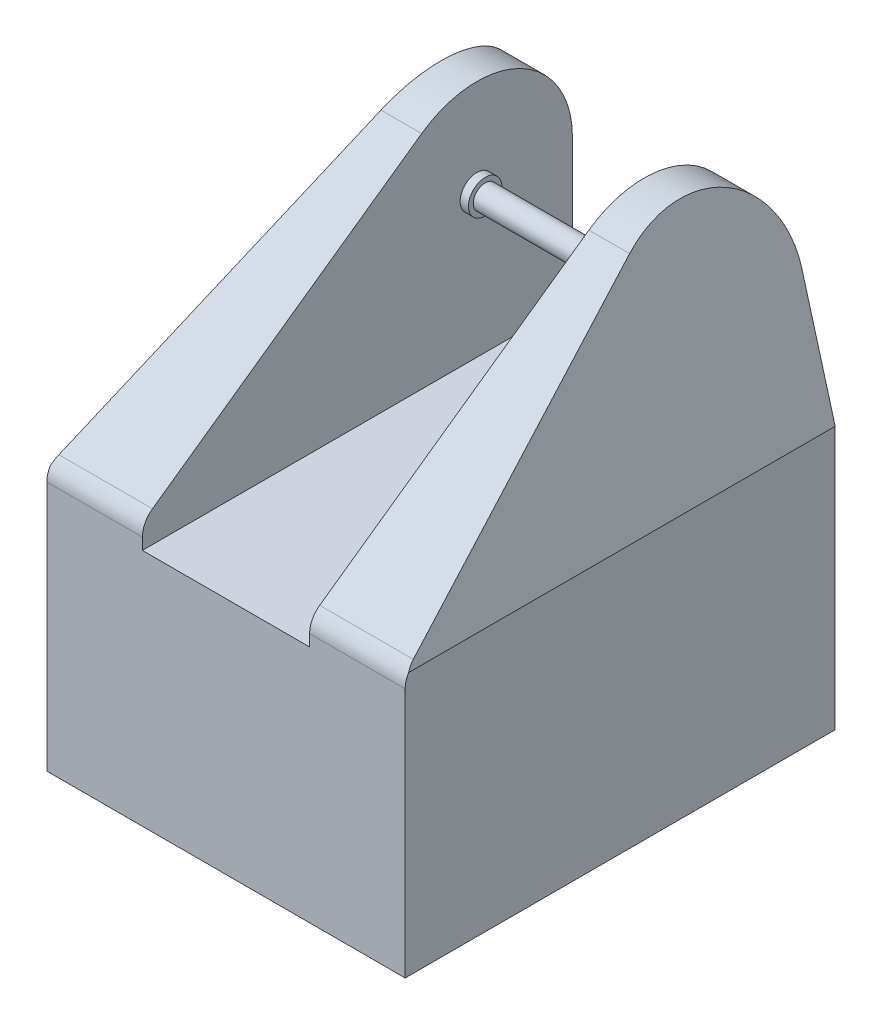
ISO-10303-21;
HEADER;
FILE_DESCRIPTION(('STEP AP214'),'2;1');
FILE_NAME('part.step','',(''),(''),'','','');
FILE_SCHEMA(('AUTOMOTIVE_DESIGN { 1 0 10303 214 1 1 1 1 }'));
ENDSEC;
DATA;
#1=APPLICATION_CONTEXT('core data for automotive mechanical design processes');
#2=APPLICATION_PROTOCOL_DEFINITION('international standard','automotive_design',2000,#1);
#3=PRODUCT_CONTEXT('',#1,'mechanical');
#4=PRODUCT('Part','Part','',(#3));
#5=PRODUCT_RELATED_PRODUCT_CATEGORY('part','',(#4));
#6=PRODUCT_DEFINITION_FORMATION('','',#4);
#7=PRODUCT_DEFINITION_CONTEXT('part definition',#1,'design');
#8=PRODUCT_DEFINITION('design','',#6,#7);
#9=PRODUCT_DEFINITION_SHAPE('','',#8);
#10=(LENGTH_UNIT() NAMED_UNIT(*) SI_UNIT(.MILLI.,.METRE.));
#11=(NAMED_UNIT(*) PLANE_ANGLE_UNIT() SI_UNIT($,.RADIAN.));
#12=(NAMED_UNIT(*) SI_UNIT($,.STERADIAN.) SOLID_ANGLE_UNIT());
#13=UNCERTAINTY_MEASURE_WITH_UNIT(LENGTH_MEASURE(1.E-05),#10,'distance_accuracy_value','');
#14=(GEOMETRIC_REPRESENTATION_CONTEXT(3) GLOBAL_UNCERTAINTY_ASSIGNED_CONTEXT((#13)) GLOBAL_UNIT_ASSIGNED_CONTEXT((#10,
#11,#12)) REPRESENTATION_CONTEXT('',''));
#15=CARTESIAN_POINT('',(0.,0.,0.));
#16=DIRECTION('',(0.,0.,1.));
#17=DIRECTION('',(1.,0.,0.));
#18=AXIS2_PLACEMENT_3D('',#15,#16,#17);
#19=CARTESIAN_POINT('',(40.,202.91684934404,180.));
#20=DIRECTION('',(-1.,0.,0.));
#21=DIRECTION('',(0.,-1.,0.));
#22=AXIS2_PLACEMENT_3D('',#19,#20,#21);
#23=PLANE('',#22);
#24=DIRECTION('',(0.,0.577326268399917,-0.816513551519769));
#25=VECTOR('',#24,1.);
#26=CARTESIAN_POINT('',(40.,192.660542060791,63.0930507359967));
#27=LINE('',#26,#25);
#28=CARTESIAN_POINT('',(40.,112.988568257822,175.773262683999));
#29=VERTEX_POINT('',#28);
#30=CARTESIAN_POINT('',(40.,192.660542060791,63.0930507359967));
#31=VERTEX_POINT('',#30);
#32=EDGE_CURVE('E307',#29,#31,#27,.T.);
#33=ORIENTED_EDGE('',*,*,#32,.F.);
#34=CARTESIAN_POINT('',(40.,104.823432742624,170.));
#35=DIRECTION('',(-1.,0.,0.));
#36=DIRECTION('',(0.,-1.,0.));
#37=AXIS2_PLACEMENT_3D('',#34,#35,#36);
#38=CIRCLE('',#37,10.);
#39=CARTESIAN_POINT('',(40.,104.823432742624,180.));
#40=VERTEX_POINT('',#39);
#41=EDGE_CURVE('E205',#29,#40,#38,.F.);
#42=ORIENTED_EDGE('',*,*,#41,.T.);
#43=DIRECTION('',(0.,1.,0.));
#44=VECTOR('',#43,1.);
#45=CARTESIAN_POINT('',(40.,100.,180.));
#46=LINE('',#45,#44);
#47=CARTESIAN_POINT('',(40.,100.,180.));
#48=VERTEX_POINT('',#47);
#49=EDGE_CURVE('E288',#48,#40,#46,.T.);
#50=ORIENTED_EDGE('',*,*,#49,.F.);
#51=DIRECTION('',(0.,0.,-1.));
#52=VECTOR('',#51,1.);
#53=CARTESIAN_POINT('',(40.,100.,180.));
#54=LINE('',#53,#52);
#55=CARTESIAN_POINT('',(40.,100.,0.));
#56=VERTEX_POINT('',#55);
#57=EDGE_CURVE('E157',#48,#56,#54,.T.);
#58=ORIENTED_EDGE('',*,*,#57,.T.);
#59=DIRECTION('',(0.,1.,0.));
#60=VECTOR('',#59,1.);
#61=CARTESIAN_POINT('',(40.,202.91684934404,0.));
#62=LINE('',#61,#60);
#63=CARTESIAN_POINT('',(40.,160.,0.));
#64=VERTEX_POINT('',#63);
#65=EDGE_CURVE('E295',#56,#64,#62,.T.);
#66=ORIENTED_EDGE('',*,*,#65,.T.);
#67=CARTESIAN_POINT('',(40.,160.,40.));
#68=DIRECTION('',(-1.,0.,0.));
#69=DIRECTION('',(0.,-1.,0.));
#70=AXIS2_PLACEMENT_3D('',#67,#68,#69);
#71=CIRCLE('',#70,40.);
#72=EDGE_CURVE('E310',#31,#64,#71,.T.);
#73=ORIENTED_EDGE('',*,*,#72,.F.);
#74=EDGE_LOOP('',(#33,#42,#50,#58,#66,#73));
#75=FACE_BOUND('',#74,.T.);
#76=CARTESIAN_POINT('',(40.,160.,40.));
#77=DIRECTION('',(-1.,0.,0.));
#78=DIRECTION('',(0.,-1.,0.));
#79=AXIS2_PLACEMENT_3D('',#76,#77,#78);
#80=CIRCLE('',#79,7.);
#81=CARTESIAN_POINT('',(40.,153.,40.));
#82=VERTEX_POINT('',#81);
#83=EDGE_CURVE('E11',#82,#82,#80,.F.);
#84=ORIENTED_EDGE('',*,*,#83,.F.);
#85=EDGE_LOOP('',(#84));
#86=FACE_BOUND('',#85,.T.);
#87=ADVANCED_FACE('F38',(#75,#86),#23,.F.);
#88=CARTESIAN_POINT('',(110.,110.,180.));
#89=DIRECTION('',(1.,0.,0.));
#90=DIRECTION('',(0.,0.,-1.));
#91=AXIS2_PLACEMENT_3D('',#88,#89,#90);
#92=PLANE('',#91);
#93=DIRECTION('',(0.,-1.,0.));
#94=VECTOR('',#93,1.);
#95=CARTESIAN_POINT('',(110.,110.,0.));
#96=LINE('',#95,#94);
#97=CARTESIAN_POINT('',(110.,160.,0.));
#98=VERTEX_POINT('',#97);
#99=CARTESIAN_POINT('',(110.,100.,0.));
#100=VERTEX_POINT('',#99);
#101=EDGE_CURVE('E285',#98,#100,#96,.T.);
#102=ORIENTED_EDGE('',*,*,#101,.T.);
#103=DIRECTION('',(0.,0.,-1.));
#104=VECTOR('',#103,1.);
#105=CARTESIAN_POINT('',(110.,100.,180.));
#106=LINE('',#105,#104);
#107=CARTESIAN_POINT('',(110.,100.,180.));
#108=VERTEX_POINT('',#107);
#109=EDGE_CURVE('E291',#108,#100,#106,.T.);
#110=ORIENTED_EDGE('',*,*,#109,.F.);
#111=DIRECTION('',(0.,-1.,0.));
#112=VECTOR('',#111,1.);
#113=CARTESIAN_POINT('',(110.,110.,180.));
#114=LINE('',#113,#112);
#115=CARTESIAN_POINT('',(110.,104.823432742624,180.));
#116=VERTEX_POINT('',#115);
#117=EDGE_CURVE('E281',#116,#108,#114,.T.);
#118=ORIENTED_EDGE('',*,*,#117,.F.);
#119=CARTESIAN_POINT('',(110.,104.823432742624,170.));
#120=DIRECTION('',(1.,0.,0.));
#121=DIRECTION('',(0.,0.,-1.));
#122=AXIS2_PLACEMENT_3D('',#119,#120,#121);
#123=CIRCLE('',#122,10.);
#124=CARTESIAN_POINT('',(110.,112.988568257822,175.773262683999));
#125=VERTEX_POINT('',#124);
#126=EDGE_CURVE('E207',#116,#125,#123,.F.);
#127=ORIENTED_EDGE('',*,*,#126,.T.);
#128=DIRECTION('',(0.,-0.577326268399917,0.816513551519769));
#129=VECTOR('',#128,1.);
#130=CARTESIAN_POINT('',(110.,192.660542060791,63.0930507359967));
#131=LINE('',#130,#129);
#132=CARTESIAN_POINT('',(110.,192.660542060791,63.0930507359967));
#133=VERTEX_POINT('',#132);
#134=EDGE_CURVE('E313',#133,#125,#131,.T.);
#135=ORIENTED_EDGE('',*,*,#134,.F.);
#136=CARTESIAN_POINT('',(110.,160.,40.));
#137=DIRECTION('',(1.,0.,0.));
#138=DIRECTION('',(0.,0.,-1.));
#139=AXIS2_PLACEMENT_3D('',#136,#137,#138);
#140=CIRCLE('',#139,40.);
#141=EDGE_CURVE('E316',#98,#133,#140,.T.);
#142=ORIENTED_EDGE('',*,*,#141,.F.);
#143=EDGE_LOOP('',(#102,#110,#118,#127,#135,#142));
#144=FACE_BOUND('',#143,.T.);
#145=CARTESIAN_POINT('',(110.,160.,40.));
#146=DIRECTION('',(1.,0.,0.));
#147=DIRECTION('',(0.,0.,-1.));
#148=AXIS2_PLACEMENT_3D('',#145,#146,#147);
#149=CIRCLE('',#148,7.);
#150=CARTESIAN_POINT('',(110.,160.,33.));
#151=VERTEX_POINT('',#150);
#152=EDGE_CURVE('E46',#151,#151,#149,.F.);
#153=ORIENTED_EDGE('',*,*,#152,.F.);
#154=EDGE_LOOP('',(#153));
#155=FACE_BOUND('',#154,.T.);
#156=ADVANCED_FACE('F214',(#144,#155),#92,.F.);
#157=CARTESIAN_POINT('',(150.,160.,40.));
#158=DIRECTION('',(-1.,0.,0.));
#159=DIRECTION('',(0.,0.,1.));
#160=AXIS2_PLACEMENT_3D('',#157,#158,#159);
#161=CYLINDRICAL_SURFACE('',#160,40.);
#162=CARTESIAN_POINT('',(136.111111111111,160.,40.));
#163=DIRECTION('',(-0.963517909629941,-0.267643863786095,0.));
#164=DIRECTION('',(-0.267643863786095,0.963517909629941,0.));
#165=AXIS2_PLACEMENT_3D('',#162,#163,#164);
#166=ELLIPSE('',#165,41.514537093932,40.);
#167=CARTESIAN_POINT('',(127.038738316447,192.660542060791,63.0930507359967));
#168=VERTEX_POINT('',#167);
#169=CARTESIAN_POINT('',(136.111111111111,160.,0.));
#170=VERTEX_POINT('',#169);
#171=EDGE_CURVE('E175',#168,#170,#166,.T.);
#172=ORIENTED_EDGE('',*,*,#171,.T.);
#173=DIRECTION('',(-1.,0.,0.));
#174=VECTOR('',#173,1.);
#175=CARTESIAN_POINT('',(150.,160.,0.));
#176=LINE('',#175,#174);
#177=EDGE_CURVE('E156',#170,#98,#176,.T.);
#178=ORIENTED_EDGE('',*,*,#177,.T.);
#179=ORIENTED_EDGE('',*,*,#141,.T.);
#180=DIRECTION('',(-1.,0.,0.));
#181=VECTOR('',#180,1.);
#182=CARTESIAN_POINT('',(150.,192.660542060791,63.0930507359967));
#183=LINE('',#182,#181);
#184=EDGE_CURVE('E184',#168,#133,#183,.T.);
#185=ORIENTED_EDGE('',*,*,#184,.F.);
#186=EDGE_LOOP('',(#172,#178,#179,#185));
#187=FACE_BOUND('',#186,.T.);
#188=ADVANCED_FACE('F216',(#187),#161,.T.);
#189=CARTESIAN_POINT('',(150.,192.660542060791,63.0930507359967));
#190=DIRECTION('',(0.,-0.816513551519769,-0.577326268399917));
#191=DIRECTION('',(0.,0.577326268399917,-0.816513551519769));
#192=AXIS2_PLACEMENT_3D('',#189,#190,#191);
#193=PLANE('',#192);
#194=DIRECTION('',(-1.,0.,0.));
#195=VECTOR('',#194,1.);
#196=CARTESIAN_POINT('',(150.,112.988568257822,175.773262683999));
#197=LINE('',#196,#195);
#198=CARTESIAN_POINT('',(149.169842150605,112.988568257822,175.773262683999));
#199=VERTEX_POINT('',#198);
#200=EDGE_CURVE('E197',#125,#199,#197,.F.);
#201=ORIENTED_EDGE('',*,*,#200,.T.);
#202=DIRECTION('',(-0.158345171090726,0.570042615926613,-0.806212269082896));
#203=VECTOR('',#202,1.);
#204=CARTESIAN_POINT('',(127.614450466932,190.587978319043,66.0242812622218));
#205=LINE('',#204,#203);
#206=EDGE_CURVE('E61',#199,#168,#205,.T.);
#207=ORIENTED_EDGE('',*,*,#206,.T.);
#208=ORIENTED_EDGE('',*,*,#184,.T.);
#209=ORIENTED_EDGE('',*,*,#134,.T.);
#210=EDGE_LOOP('',(#201,#207,#208,#209));
#211=FACE_BOUND('',#210,.T.);
#212=ADVANCED_FACE('F223',(#211),#193,.F.);
#213=CARTESIAN_POINT('',(150.,104.823432742624,170.));
#214=DIRECTION('',(-1.,0.,0.));
#215=DIRECTION('',(0.,0.,1.));
#216=AXIS2_PLACEMENT_3D('',#213,#214,#215);
#217=CYLINDRICAL_SURFACE('',#216,10.);
#218=CARTESIAN_POINT('',(151.437935349271,104.823432742624,170.));
#219=DIRECTION('',(-0.963517909629941,-0.267643863786095,0.));
#220=DIRECTION('',(-0.267643863786095,0.963517909629941,0.));
#221=AXIS2_PLACEMENT_3D('',#218,#219,#220);
#222=ELLIPSE('',#221,10.378634273483,10.);
#223=CARTESIAN_POINT('',(150.,110.,178.555884023867));
#224=VERTEX_POINT('',#223);
#225=EDGE_CURVE('E143',#199,#224,#222,.F.);
#226=ORIENTED_EDGE('',*,*,#225,.F.);
#227=ORIENTED_EDGE('',*,*,#200,.F.);
#228=ORIENTED_EDGE('',*,*,#126,.F.);
#229=DIRECTION('',(-1.,0.,0.));
#230=VECTOR('',#229,1.);
#231=CARTESIAN_POINT('',(150.,104.823432742624,180.));
#232=LINE('',#231,#230);
#233=CARTESIAN_POINT('',(150.,104.823432742624,180.));
#234=VERTEX_POINT('',#233);
#235=EDGE_CURVE('E191',#234,#116,#232,.T.);
#236=ORIENTED_EDGE('',*,*,#235,.F.);
#237=CARTESIAN_POINT('',(150.,104.823432742624,170.));
#238=DIRECTION('',(-1.,0.,0.));
#239=DIRECTION('',(0.,0.,1.));
#240=AXIS2_PLACEMENT_3D('',#237,#238,#239);
#241=CIRCLE('',#240,10.);
#242=EDGE_CURVE('E201',#224,#234,#241,.F.);
#243=ORIENTED_EDGE('',*,*,#242,.F.);
#244=EDGE_LOOP('',(#226,#227,#228,#236,#243));
#245=FACE_BOUND('',#244,.T.);
#246=ADVANCED_FACE('F258',(#245),#217,.T.);
#247=CARTESIAN_POINT('',(150.,0.,180.));
#248=DIRECTION('',(0.,1.,0.));
#249=DIRECTION('',(0.,0.,1.));
#250=AXIS2_PLACEMENT_3D('',#247,#248,#249);
#251=PLANE('',#250);
#252=DIRECTION('',(0.,0.,-1.));
#253=VECTOR('',#252,1.);
#254=CARTESIAN_POINT('',(0.,0.,180.));
#255=LINE('',#254,#253);
#256=CARTESIAN_POINT('',(0.,0.,180.));
#257=VERTEX_POINT('',#256);
#258=CARTESIAN_POINT('',(0.,0.,0.));
#259=VERTEX_POINT('',#258);
#260=EDGE_CURVE('E171',#257,#259,#255,.T.);
#261=ORIENTED_EDGE('',*,*,#260,.T.);
#262=DIRECTION('',(-1.,0.,0.));
#263=VECTOR('',#262,1.);
#264=CARTESIAN_POINT('',(150.,0.,0.));
#265=LINE('',#264,#263);
#266=CARTESIAN_POINT('',(150.,0.,0.));
#267=VERTEX_POINT('',#266);
#268=EDGE_CURVE('E188',#267,#259,#265,.T.);
#269=ORIENTED_EDGE('',*,*,#268,.F.);
#270=DIRECTION('',(0.,0.,-1.));
#271=VECTOR('',#270,1.);
#272=CARTESIAN_POINT('',(150.,0.,180.));
#273=LINE('',#272,#271);
#274=CARTESIAN_POINT('',(150.,0.,180.));
#275=VERTEX_POINT('',#274);
#276=EDGE_CURVE('E161',#275,#267,#273,.T.);
#277=ORIENTED_EDGE('',*,*,#276,.F.);
#278=DIRECTION('',(-1.,0.,0.));
#279=VECTOR('',#278,1.);
#280=CARTESIAN_POINT('',(150.,0.,180.));
#281=LINE('',#280,#279);
#282=EDGE_CURVE('E165',#275,#257,#281,.T.);
#283=ORIENTED_EDGE('',*,*,#282,.T.);
#284=EDGE_LOOP('',(#261,#269,#277,#283));
#285=FACE_BOUND('',#284,.T.);
#286=CARTESIAN_POINT('',(75.,0.,40.));
#287=DIRECTION('',(0.,-1.,0.));
#288=DIRECTION('',(0.,0.,-1.));
#289=AXIS2_PLACEMENT_3D('',#286,#287,#288);
#290=CIRCLE('',#289,11.405);
#291=CARTESIAN_POINT('',(75.,0.,28.595));
#292=VERTEX_POINT('',#291);
#293=EDGE_CURVE('E268',#292,#292,#290,.T.);
#294=ORIENTED_EDGE('',*,*,#293,.F.);
#295=EDGE_LOOP('',(#294));
#296=FACE_BOUND('',#295,.T.);
#297=ADVANCED_FACE('F256',(#285,#296),#251,.F.);
#298=CARTESIAN_POINT('',(150.,0.,0.));
#299=DIRECTION('',(0.,0.,1.));
#300=DIRECTION('',(1.,0.,0.));
#301=AXIS2_PLACEMENT_3D('',#298,#299,#300);
#302=PLANE('',#301);
#303=ORIENTED_EDGE('',*,*,#177,.F.);
#304=DIRECTION('',(-0.267643863786095,0.963517909629941,0.));
#305=VECTOR('',#304,1.);
#306=CARTESIAN_POINT('',(150.,110.,0.));
#307=LINE('',#306,#305);
#308=CARTESIAN_POINT('',(150.,110.,0.));
#309=VERTEX_POINT('',#308);
#310=EDGE_CURVE('E141',#309,#170,#307,.T.);
#311=ORIENTED_EDGE('',*,*,#310,.F.);
#312=DIRECTION('',(0.,1.,0.));
#313=VECTOR('',#312,1.);
#314=CARTESIAN_POINT('',(150.,0.,0.));
#315=LINE('',#314,#313);
#316=EDGE_CURVE('E152',#267,#309,#315,.T.);
#317=ORIENTED_EDGE('',*,*,#316,.F.);
#318=ORIENTED_EDGE('',*,*,#268,.T.);
#319=DIRECTION('',(0.,1.,0.));
#320=VECTOR('',#319,1.);
#321=CARTESIAN_POINT('',(0.,0.,0.));
#322=LINE('',#321,#320);
#323=CARTESIAN_POINT('',(0.,110.,0.));
#324=VERTEX_POINT('',#323);
#325=EDGE_CURVE('E174',#259,#324,#322,.T.);
#326=ORIENTED_EDGE('',*,*,#325,.T.);
#327=DIRECTION('',(-0.267643863786086,-0.963517909629943,0.));
#328=VECTOR('',#327,1.);
#329=CARTESIAN_POINT('',(0.,110.,0.));
#330=LINE('',#329,#328);
#331=CARTESIAN_POINT('',(13.8888888888884,160.,0.));
#332=VERTEX_POINT('',#331);
#333=EDGE_CURVE('E274',#332,#324,#330,.T.);
#334=ORIENTED_EDGE('',*,*,#333,.F.);
#335=EDGE_CURVE('E185',#64,#332,#176,.T.);
#336=ORIENTED_EDGE('',*,*,#335,.F.);
#337=ORIENTED_EDGE('',*,*,#65,.F.);
#338=DIRECTION('',(-1.,0.,0.));
#339=VECTOR('',#338,1.);
#340=CARTESIAN_POINT('',(110.,100.,0.));
#341=LINE('',#340,#339);
#342=EDGE_CURVE('E292',#100,#56,#341,.T.);
#343=ORIENTED_EDGE('',*,*,#342,.F.);
#344=ORIENTED_EDGE('',*,*,#101,.F.);
#345=EDGE_LOOP('',(#303,#311,#317,#318,#326,#334,#336,#337,#343,#344));
#346=FACE_BOUND('',#345,.T.);
#347=ADVANCED_FACE('F150',(#346),#302,.F.);
#348=CARTESIAN_POINT('',(22.9612616835522,192.660542060791,63.0930507359967));
#349=VERTEX_POINT('',#348);
#350=EDGE_CURVE('E181',#31,#349,#183,.T.);
#351=ORIENTED_EDGE('',*,*,#350,.F.);
#352=ORIENTED_EDGE('',*,*,#72,.T.);
#353=ORIENTED_EDGE('',*,*,#335,.T.);
#354=CARTESIAN_POINT('',(13.8888888888884,160.,40.));
#355=DIRECTION('',(0.963517909629943,-0.267643863786086,0.));
#356=DIRECTION('',(-0.267643863786086,-0.963517909629943,0.));
#357=AXIS2_PLACEMENT_3D('',#354,#355,#356);
#358=ELLIPSE('',#357,41.5145370939319,40.);
#359=EDGE_CURVE('E305',#332,#349,#358,.T.);
#360=ORIENTED_EDGE('',*,*,#359,.T.);
#361=EDGE_LOOP('',(#351,#352,#353,#360));
#362=FACE_BOUND('',#361,.T.);
#363=ADVANCED_FACE('F226',(#362),#161,.T.);
#364=CARTESIAN_POINT('',(0.830157849394941,112.988568257822,175.773262683999));
#365=VERTEX_POINT('',#364);
#366=EDGE_CURVE('E200',#365,#29,#197,.F.);
#367=ORIENTED_EDGE('',*,*,#366,.T.);
#368=ORIENTED_EDGE('',*,*,#32,.T.);
#369=ORIENTED_EDGE('',*,*,#350,.T.);
#370=DIRECTION('',(-0.15834517109072,-0.570042615926614,0.806212269082897));
#371=VECTOR('',#370,1.);
#372=CARTESIAN_POINT('',(26.1465285142292,204.127502651228,46.8753083097162));
#373=LINE('',#372,#371);
#374=EDGE_CURVE('E147',#349,#365,#373,.T.);
#375=ORIENTED_EDGE('',*,*,#374,.T.);
#376=EDGE_LOOP('',(#367,#368,#369,#375));
#377=FACE_BOUND('',#376,.T.);
#378=ADVANCED_FACE('F248',(#377),#193,.F.);
#379=CARTESIAN_POINT('',(150.,110.,180.));
#380=DIRECTION('',(0.,0.,-1.));
#381=DIRECTION('',(-1.,0.,0.));
#382=AXIS2_PLACEMENT_3D('',#379,#380,#381);
#383=PLANE('',#382);
#384=ORIENTED_EDGE('',*,*,#235,.T.);
#385=ORIENTED_EDGE('',*,*,#117,.T.);
#386=DIRECTION('',(-1.,0.,0.));
#387=VECTOR('',#386,1.);
#388=CARTESIAN_POINT('',(110.,100.,180.));
#389=LINE('',#388,#387);
#390=EDGE_CURVE('E284',#108,#48,#389,.T.);
#391=ORIENTED_EDGE('',*,*,#390,.T.);
#392=ORIENTED_EDGE('',*,*,#49,.T.);
#393=CARTESIAN_POINT('',(0.,104.823432742624,180.));
#394=VERTEX_POINT('',#393);
#395=EDGE_CURVE('E190',#40,#394,#232,.T.);
#396=ORIENTED_EDGE('',*,*,#395,.T.);
#397=DIRECTION('',(0.,-1.,0.));
#398=VECTOR('',#397,1.);
#399=CARTESIAN_POINT('',(0.,110.,180.));
#400=LINE('',#399,#398);
#401=EDGE_CURVE('E167',#394,#257,#400,.T.);
#402=ORIENTED_EDGE('',*,*,#401,.T.);
#403=ORIENTED_EDGE('',*,*,#282,.F.);
#404=DIRECTION('',(0.,-1.,0.));
#405=VECTOR('',#404,1.);
#406=CARTESIAN_POINT('',(150.,110.,180.));
#407=LINE('',#406,#405);
#408=EDGE_CURVE('E163',#234,#275,#407,.T.);
#409=ORIENTED_EDGE('',*,*,#408,.F.);
#410=EDGE_LOOP('',(#384,#385,#391,#392,#396,#402,#403,#409));
#411=FACE_BOUND('',#410,.T.);
#412=ADVANCED_FACE('F242',(#411),#383,.F.);
#413=CARTESIAN_POINT('',(150.,160.,40.));
#414=DIRECTION('',(-1.,0.,0.));
#415=DIRECTION('',(0.,0.,1.));
#416=AXIS2_PLACEMENT_3D('',#413,#414,#415);
#417=PLANE('',#416);
#418=ORIENTED_EDGE('',*,*,#316,.T.);
#419=DIRECTION('',(0.,0.,-1.));
#420=VECTOR('',#419,1.);
#421=CARTESIAN_POINT('',(150.,110.,180.));
#422=LINE('',#421,#420);
#423=EDGE_CURVE('E138',#224,#309,#422,.T.);
#424=ORIENTED_EDGE('',*,*,#423,.F.);
#425=ORIENTED_EDGE('',*,*,#242,.T.);
#426=ORIENTED_EDGE('',*,*,#408,.T.);
#427=ORIENTED_EDGE('',*,*,#276,.T.);
#428=EDGE_LOOP('',(#418,#424,#425,#426,#427));
#429=FACE_BOUND('',#428,.T.);
#430=ADVANCED_FACE('F159',(#429),#417,.F.);
#431=CARTESIAN_POINT('',(0.,160.,40.));
#432=DIRECTION('',(-1.,0.,0.));
#433=DIRECTION('',(0.,0.,1.));
#434=AXIS2_PLACEMENT_3D('',#431,#432,#433);
#435=PLANE('',#434);
#436=DIRECTION('',(0.,0.,-1.));
#437=VECTOR('',#436,1.);
#438=CARTESIAN_POINT('',(0.,110.,180.));
#439=LINE('',#438,#437);
#440=CARTESIAN_POINT('',(0.,110.,178.555884023867));
#441=VERTEX_POINT('',#440);
#442=EDGE_CURVE('E53',#441,#324,#439,.T.);
#443=ORIENTED_EDGE('',*,*,#442,.T.);
#444=ORIENTED_EDGE('',*,*,#325,.F.);
#445=ORIENTED_EDGE('',*,*,#260,.F.);
#446=ORIENTED_EDGE('',*,*,#401,.F.);
#447=CARTESIAN_POINT('',(0.,104.823432742624,170.));
#448=DIRECTION('',(-1.,0.,0.));
#449=DIRECTION('',(0.,0.,1.));
#450=AXIS2_PLACEMENT_3D('',#447,#448,#449);
#451=CIRCLE('',#450,10.);
#452=EDGE_CURVE('E194',#394,#441,#451,.T.);
#453=ORIENTED_EDGE('',*,*,#452,.T.);
#454=EDGE_LOOP('',(#443,#444,#445,#446,#453));
#455=FACE_BOUND('',#454,.T.);
#456=ADVANCED_FACE('F241',(#455),#435,.T.);
#457=ORIENTED_EDGE('',*,*,#41,.F.);
#458=ORIENTED_EDGE('',*,*,#366,.F.);
#459=CARTESIAN_POINT('',(-1.437935349271,104.823432742624,170.));
#460=DIRECTION('',(0.963517909629943,-0.267643863786086,0.));
#461=DIRECTION('',(-0.267643863786086,-0.963517909629943,0.));
#462=AXIS2_PLACEMENT_3D('',#459,#460,#461);
#463=ELLIPSE('',#462,10.378634273483,10.);
#464=EDGE_CURVE('E203',#441,#365,#463,.F.);
#465=ORIENTED_EDGE('',*,*,#464,.F.);
#466=ORIENTED_EDGE('',*,*,#452,.F.);
#467=ORIENTED_EDGE('',*,*,#395,.F.);
#468=EDGE_LOOP('',(#457,#458,#465,#466,#467));
#469=FACE_BOUND('',#468,.T.);
#470=ADVANCED_FACE('F40',(#469),#217,.T.);
#471=CARTESIAN_POINT('',(0.,110.,180.));
#472=DIRECTION('',(0.963517909629943,-0.267643863786086,0.));
#473=DIRECTION('',(0.267643863786086,0.963517909629943,0.));
#474=AXIS2_PLACEMENT_3D('',#471,#472,#473);
#475=PLANE('',#474);
#476=ORIENTED_EDGE('',*,*,#333,.T.);
#477=ORIENTED_EDGE('',*,*,#442,.F.);
#478=ORIENTED_EDGE('',*,*,#464,.T.);
#479=ORIENTED_EDGE('',*,*,#374,.F.);
#480=ORIENTED_EDGE('',*,*,#359,.F.);
#481=EDGE_LOOP('',(#476,#477,#478,#479,#480));
#482=FACE_BOUND('',#481,.T.);
#483=ADVANCED_FACE('F235',(#482),#475,.F.);
#484=CARTESIAN_POINT('',(110.,100.,180.));
#485=DIRECTION('',(0.,-1.,0.));
#486=DIRECTION('',(0.,0.,-1.));
#487=AXIS2_PLACEMENT_3D('',#484,#485,#486);
#488=PLANE('',#487);
#489=ORIENTED_EDGE('',*,*,#342,.T.);
#490=ORIENTED_EDGE('',*,*,#57,.F.);
#491=ORIENTED_EDGE('',*,*,#390,.F.);
#492=ORIENTED_EDGE('',*,*,#109,.T.);
#493=EDGE_LOOP('',(#489,#490,#491,#492));
#494=FACE_BOUND('',#493,.T.);
#495=ADVANCED_FACE('F232',(#494),#488,.F.);
#496=CARTESIAN_POINT('',(150.,110.,180.));
#497=DIRECTION('',(-0.963517909629941,-0.267643863786095,0.));
#498=DIRECTION('',(0.267643863786095,-0.963517909629941,0.));
#499=AXIS2_PLACEMENT_3D('',#496,#497,#498);
#500=PLANE('',#499);
#501=ORIENTED_EDGE('',*,*,#171,.F.);
#502=ORIENTED_EDGE('',*,*,#206,.F.);
#503=ORIENTED_EDGE('',*,*,#225,.T.);
#504=ORIENTED_EDGE('',*,*,#423,.T.);
#505=ORIENTED_EDGE('',*,*,#310,.T.);
#506=EDGE_LOOP('',(#501,#502,#503,#504,#505));
#507=FACE_BOUND('',#506,.T.);
#508=ADVANCED_FACE('F140',(#507),#500,.F.);
#509=CARTESIAN_POINT('',(75.,45.3553390593274,40.));
#510=DIRECTION('',(0.,-1.,0.));
#511=DIRECTION('',(0.,0.,-1.));
#512=AXIS2_PLACEMENT_3D('',#509,#510,#511);
#513=CYLINDRICAL_SURFACE('',#512,11.405);
#514=CARTESIAN_POINT('',(75.,10.,40.));
#515=DIRECTION('',(0.,-1.,0.));
#516=DIRECTION('',(0.,0.,-1.));
#517=AXIS2_PLACEMENT_3D('',#514,#515,#516);
#518=CIRCLE('',#517,11.405);
#519=CARTESIAN_POINT('',(75.,10.,28.595));
#520=VERTEX_POINT('',#519);
#521=EDGE_CURVE('E270',#520,#520,#518,.F.);
#522=ORIENTED_EDGE('',*,*,#521,.T.);
#523=EDGE_LOOP('',(#522));
#524=FACE_BOUND('',#523,.T.);
#525=ORIENTED_EDGE('',*,*,#293,.T.);
#526=EDGE_LOOP('',(#525));
#527=FACE_BOUND('',#526,.T.);
#528=ADVANCED_FACE('F369',(#524,#527),#513,.F.);
#529=CARTESIAN_POINT('',(75.,10.,40.));
#530=DIRECTION('',(0.,-1.,0.));
#531=DIRECTION('',(0.,0.,-1.));
#532=AXIS2_PLACEMENT_3D('',#529,#530,#531);
#533=PLANE('',#532);
#534=ORIENTED_EDGE('',*,*,#521,.F.);
#535=EDGE_LOOP('',(#534));
#536=FACE_BOUND('',#535,.T.);
#537=ADVANCED_FACE('F367',(#536),#533,.T.);
#538=CARTESIAN_POINT('',(15.857864376269,160.,40.));
#539=DIRECTION('',(1.,0.,0.));
#540=DIRECTION('',(0.,1.,0.));
#541=AXIS2_PLACEMENT_3D('',#538,#539,#540);
#542=CYLINDRICAL_SURFACE('',#541,5.);
#543=CARTESIAN_POINT('',(43.5,160.,40.));
#544=DIRECTION('',(1.,0.,0.));
#545=DIRECTION('',(0.,1.,0.));
#546=AXIS2_PLACEMENT_3D('',#543,#544,#545);
#547=CIRCLE('',#546,5.00000000000001);
#548=CARTESIAN_POINT('',(43.5,165.,40.));
#549=VERTEX_POINT('',#548);
#550=EDGE_CURVE('E538',#549,#549,#547,.T.);
#551=ORIENTED_EDGE('',*,*,#550,.T.);
#552=EDGE_LOOP('',(#551));
#553=FACE_BOUND('',#552,.T.);
#554=CARTESIAN_POINT('',(106.5,160.,40.));
#555=DIRECTION('',(-1.,0.,0.));
#556=DIRECTION('',(0.,0.,1.));
#557=AXIS2_PLACEMENT_3D('',#554,#555,#556);
#558=CIRCLE('',#557,5.00000000000001);
#559=CARTESIAN_POINT('',(106.5,160.,45.));
#560=VERTEX_POINT('',#559);
#561=EDGE_CURVE('E277',#560,#560,#558,.T.);
#562=ORIENTED_EDGE('',*,*,#561,.T.);
#563=EDGE_LOOP('',(#562));
#564=FACE_BOUND('',#563,.T.);
#565=ADVANCED_FACE('F360',(#553,#564),#542,.T.);
#566=CARTESIAN_POINT('',(106.5,160.,40.));
#567=DIRECTION('',(-1.,0.,0.));
#568=DIRECTION('',(0.,0.,1.));
#569=AXIS2_PLACEMENT_3D('',#566,#567,#568);
#570=PLANE('',#569);
#571=CARTESIAN_POINT('',(106.5,160.,40.));
#572=DIRECTION('',(-1.,0.,0.));
#573=DIRECTION('',(0.,0.,1.));
#574=AXIS2_PLACEMENT_3D('',#571,#572,#573);
#575=CIRCLE('',#574,7.);
#576=CARTESIAN_POINT('',(106.5,160.,47.));
#577=VERTEX_POINT('',#576);
#578=EDGE_CURVE('E271',#577,#577,#575,.T.);
#579=ORIENTED_EDGE('',*,*,#578,.T.);
#580=EDGE_LOOP('',(#579));
#581=FACE_BOUND('',#580,.T.);
#582=ORIENTED_EDGE('',*,*,#561,.F.);
#583=EDGE_LOOP('',(#582));
#584=FACE_BOUND('',#583,.T.);
#585=ADVANCED_FACE('F357',(#581,#584),#570,.T.);
#586=CARTESIAN_POINT('',(106.5,160.,40.));
#587=DIRECTION('',(1.,0.,0.));
#588=DIRECTION('',(0.,0.,-1.));
#589=AXIS2_PLACEMENT_3D('',#586,#587,#588);
#590=CYLINDRICAL_SURFACE('',#589,7.);
#591=ORIENTED_EDGE('',*,*,#578,.F.);
#592=EDGE_LOOP('',(#591));
#593=FACE_BOUND('',#592,.T.);
#594=ORIENTED_EDGE('',*,*,#152,.T.);
#595=EDGE_LOOP('',(#594));
#596=FACE_BOUND('',#595,.T.);
#597=ADVANCED_FACE('F212',(#593,#596),#590,.T.);
#598=CARTESIAN_POINT('',(43.5,160.,40.));
#599=DIRECTION('',(1.,0.,0.));
#600=DIRECTION('',(0.,1.,0.));
#601=AXIS2_PLACEMENT_3D('',#598,#599,#600);
#602=PLANE('',#601);
#603=CARTESIAN_POINT('',(43.5,160.,40.));
#604=DIRECTION('',(1.,0.,0.));
#605=DIRECTION('',(0.,1.,0.));
#606=AXIS2_PLACEMENT_3D('',#603,#604,#605);
#607=CIRCLE('',#606,7.);
#608=CARTESIAN_POINT('',(43.5,167.,40.));
#609=VERTEX_POINT('',#608);
#610=EDGE_CURVE('E542',#609,#609,#607,.T.);
#611=ORIENTED_EDGE('',*,*,#610,.T.);
#612=EDGE_LOOP('',(#611));
#613=FACE_BOUND('',#612,.T.);
#614=ORIENTED_EDGE('',*,*,#550,.F.);
#615=EDGE_LOOP('',(#614));
#616=FACE_BOUND('',#615,.T.);
#617=ADVANCED_FACE('F347',(#613,#616),#602,.T.);
#618=CARTESIAN_POINT('',(43.5,160.,40.));
#619=DIRECTION('',(-1.,0.,0.));
#620=DIRECTION('',(0.,-1.,0.));
#621=AXIS2_PLACEMENT_3D('',#618,#619,#620);
#622=CYLINDRICAL_SURFACE('',#621,7.);
#623=ORIENTED_EDGE('',*,*,#610,.F.);
#624=EDGE_LOOP('',(#623));
#625=FACE_BOUND('',#624,.T.);
#626=ORIENTED_EDGE('',*,*,#83,.T.);
#627=EDGE_LOOP('',(#626));
#628=FACE_BOUND('',#627,.T.);
#629=ADVANCED_FACE('F345',(#625,#628),#622,.T.);
#630=CLOSED_SHELL('',(#87,#156,#188,#212,#246,#297,#347,#363,#378,#412,#430,#456,#470,#483,#495,
#508,#528,#537,#565,#585,#597,#617,#629));
#631=MANIFOLD_SOLID_BREP('B2',#630);
#632=ADVANCED_BREP_SHAPE_REPRESENTATION('',(#18,#631),#14);
#633=SHAPE_DEFINITION_REPRESENTATION(#9,#632);
ENDSEC;
END-ISO-10303-21;
